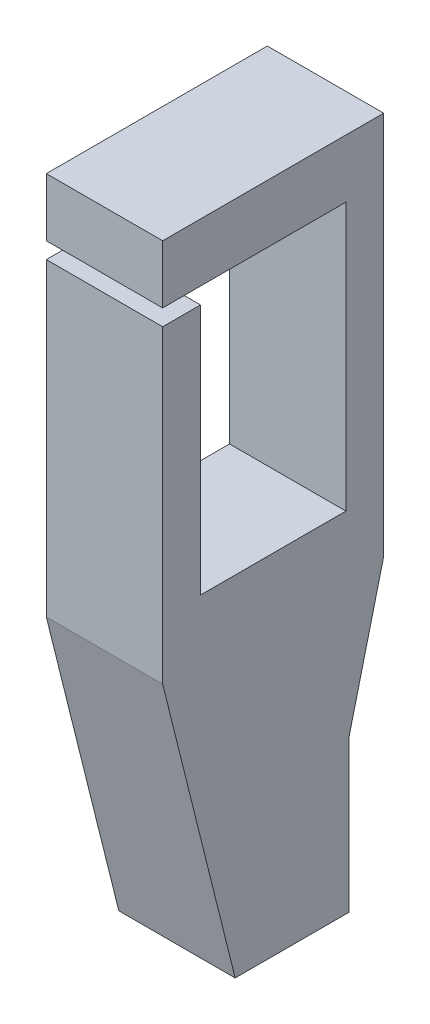
ISO-10303-21;
HEADER;
FILE_DESCRIPTION(('STEP AP214'),'2;1');
FILE_NAME('part.step','',(''),(''),'','','');
FILE_SCHEMA(('AUTOMOTIVE_DESIGN { 1 0 10303 214 1 1 1 1 }'));
ENDSEC;
DATA;
#1=APPLICATION_CONTEXT('core data for automotive mechanical design processes');
#2=APPLICATION_PROTOCOL_DEFINITION('international standard','automotive_design',2000,#1);
#3=PRODUCT_CONTEXT('',#1,'mechanical');
#4=PRODUCT('Part','Part','',(#3));
#5=PRODUCT_RELATED_PRODUCT_CATEGORY('part','',(#4));
#6=PRODUCT_DEFINITION_FORMATION('','',#4);
#7=PRODUCT_DEFINITION_CONTEXT('part definition',#1,'design');
#8=PRODUCT_DEFINITION('design','',#6,#7);
#9=PRODUCT_DEFINITION_SHAPE('','',#8);
#10=(LENGTH_UNIT() NAMED_UNIT(*) SI_UNIT(.MILLI.,.METRE.));
#11=(NAMED_UNIT(*) PLANE_ANGLE_UNIT() SI_UNIT($,.RADIAN.));
#12=(NAMED_UNIT(*) SI_UNIT($,.STERADIAN.) SOLID_ANGLE_UNIT());
#13=UNCERTAINTY_MEASURE_WITH_UNIT(LENGTH_MEASURE(1.E-05),#10,'distance_accuracy_value','');
#14=(GEOMETRIC_REPRESENTATION_CONTEXT(3) GLOBAL_UNCERTAINTY_ASSIGNED_CONTEXT((#13)) GLOBAL_UNIT_ASSIGNED_CONTEXT((#10,
#11,#12)) REPRESENTATION_CONTEXT('',''));
#15=CARTESIAN_POINT('',(0.,0.,0.));
#16=DIRECTION('',(0.,0.,1.));
#17=DIRECTION('',(1.,0.,0.));
#18=AXIS2_PLACEMENT_3D('',#15,#16,#17);
#19=CARTESIAN_POINT('',(5.,16.5,9.5));
#20=DIRECTION('',(0.,0.,-1.));
#21=DIRECTION('',(0.,1.,0.));
#22=AXIS2_PLACEMENT_3D('',#19,#20,#21);
#23=PLANE('',#22);
#24=DIRECTION('',(0.,-1.,0.));
#25=VECTOR('',#24,1.);
#26=CARTESIAN_POINT('',(5.,16.5,9.5));
#27=LINE('',#26,#25);
#28=CARTESIAN_POINT('',(5.,10.1,9.5));
#29=VERTEX_POINT('',#28);
#30=CARTESIAN_POINT('',(5.,-16.5,9.5));
#31=VERTEX_POINT('',#30);
#32=EDGE_CURVE('E222',#29,#31,#27,.T.);
#33=ORIENTED_EDGE('',*,*,#32,.F.);
#34=DIRECTION('',(1.,0.,0.));
#35=VECTOR('',#34,1.);
#36=CARTESIAN_POINT('',(-5.,10.1,9.5));
#37=LINE('',#36,#35);
#38=CARTESIAN_POINT('',(-5.,10.1,9.5));
#39=VERTEX_POINT('',#38);
#40=EDGE_CURVE('E168',#39,#29,#37,.T.);
#41=ORIENTED_EDGE('',*,*,#40,.F.);
#42=DIRECTION('',(0.,-1.,0.));
#43=VECTOR('',#42,1.);
#44=CARTESIAN_POINT('',(-5.,16.5,9.5));
#45=LINE('',#44,#43);
#46=CARTESIAN_POINT('',(-5.,-16.5,9.5));
#47=VERTEX_POINT('',#46);
#48=EDGE_CURVE('E176',#39,#47,#45,.T.);
#49=ORIENTED_EDGE('',*,*,#48,.T.);
#50=DIRECTION('',(-1.,0.,0.));
#51=VECTOR('',#50,1.);
#52=CARTESIAN_POINT('',(5.,-16.5,9.5));
#53=LINE('',#52,#51);
#54=EDGE_CURVE('E198',#31,#47,#53,.T.);
#55=ORIENTED_EDGE('',*,*,#54,.F.);
#56=EDGE_LOOP('',(#33,#41,#49,#55));
#57=FACE_BOUND('',#56,.T.);
#58=ADVANCED_FACE('F43',(#57),#23,.F.);
#59=CARTESIAN_POINT('',(5.,0.,0.));
#60=DIRECTION('',(-1.,0.,0.));
#61=DIRECTION('',(0.,0.,1.));
#62=AXIS2_PLACEMENT_3D('',#59,#60,#61);
#63=PLANE('',#62);
#64=DIRECTION('',(0.,-1.,0.));
#65=VECTOR('',#64,1.);
#66=CARTESIAN_POINT('',(5.,11.5,6.25));
#67=LINE('',#66,#65);
#68=CARTESIAN_POINT('',(5.,10.1,6.25));
#69=VERTEX_POINT('',#68);
#70=CARTESIAN_POINT('',(5.,-11.5,6.25));
#71=VERTEX_POINT('',#70);
#72=EDGE_CURVE('E65',#69,#71,#67,.T.);
#73=ORIENTED_EDGE('',*,*,#72,.F.);
#74=DIRECTION('',(0.,0.,-1.));
#75=VECTOR('',#74,1.);
#76=CARTESIAN_POINT('',(5.,10.1,6.25));
#77=LINE('',#76,#75);
#78=EDGE_CURVE('E58',#29,#69,#77,.T.);
#79=ORIENTED_EDGE('',*,*,#78,.F.);
#80=ORIENTED_EDGE('',*,*,#32,.T.);
#81=DIRECTION('',(0.,-0.970295726275996,-0.241921895599669));
#82=VECTOR('',#81,1.);
#83=CARTESIAN_POINT('',(5.,-16.5,9.5));
#84=LINE('',#83,#82);
#85=CARTESIAN_POINT('',(5.,-41.5,3.26679992892044));
#86=VERTEX_POINT('',#85);
#87=EDGE_CURVE('E218',#31,#86,#84,.T.);
#88=ORIENTED_EDGE('',*,*,#87,.T.);
#89=DIRECTION('',(0.,0.,-1.));
#90=VECTOR('',#89,1.);
#91=CARTESIAN_POINT('',(5.,-41.5,3.26679992892044));
#92=LINE('',#91,#90);
#93=CARTESIAN_POINT('',(5.,-41.5,-6.50806396588192));
#94=VERTEX_POINT('',#93);
#95=EDGE_CURVE('E216',#86,#94,#92,.T.);
#96=ORIENTED_EDGE('',*,*,#95,.T.);
#97=DIRECTION('',(0.,1.,0.));
#98=VECTOR('',#97,1.);
#99=CARTESIAN_POINT('',(5.,-41.5,-6.50806396588192));
#100=LINE('',#99,#98);
#101=CARTESIAN_POINT('',(5.,-28.5,-6.50806396588192));
#102=VERTEX_POINT('',#101);
#103=EDGE_CURVE('E192',#94,#102,#100,.T.);
#104=ORIENTED_EDGE('',*,*,#103,.T.);
#105=DIRECTION('',(0.,0.970295726275998,-0.241921895599661));
#106=VECTOR('',#105,1.);
#107=CARTESIAN_POINT('',(5.,-28.5,-6.50806396588192));
#108=LINE('',#107,#106);
#109=CARTESIAN_POINT('',(5.,-16.5,-9.5));
#110=VERTEX_POINT('',#109);
#111=EDGE_CURVE('E187',#102,#110,#108,.T.);
#112=ORIENTED_EDGE('',*,*,#111,.T.);
#113=DIRECTION('',(0.,1.,0.));
#114=VECTOR('',#113,1.);
#115=CARTESIAN_POINT('',(5.,16.5,-9.5));
#116=LINE('',#115,#114);
#117=CARTESIAN_POINT('',(5.,16.5,-9.5));
#118=VERTEX_POINT('',#117);
#119=EDGE_CURVE('E224',#110,#118,#116,.T.);
#120=ORIENTED_EDGE('',*,*,#119,.T.);
#121=DIRECTION('',(0.,0.,1.));
#122=VECTOR('',#121,1.);
#123=CARTESIAN_POINT('',(5.,16.5,9.5));
#124=LINE('',#123,#122);
#125=CARTESIAN_POINT('',(5.,16.5,9.5));
#126=VERTEX_POINT('',#125);
#127=EDGE_CURVE('E206',#118,#126,#124,.T.);
#128=ORIENTED_EDGE('',*,*,#127,.T.);
#129=CARTESIAN_POINT('',(5.,11.5,9.5));
#130=VERTEX_POINT('',#129);
#131=EDGE_CURVE('E220',#126,#130,#27,.T.);
#132=ORIENTED_EDGE('',*,*,#131,.T.);
#133=DIRECTION('',(0.,0.,1.));
#134=VECTOR('',#133,1.);
#135=CARTESIAN_POINT('',(5.,11.5,6.25));
#136=LINE('',#135,#134);
#137=CARTESIAN_POINT('',(5.,11.5,-6.25));
#138=VERTEX_POINT('',#137);
#139=EDGE_CURVE('E164',#138,#130,#136,.T.);
#140=ORIENTED_EDGE('',*,*,#139,.F.);
#141=DIRECTION('',(0.,1.,0.));
#142=VECTOR('',#141,1.);
#143=CARTESIAN_POINT('',(5.,11.5,-6.25));
#144=LINE('',#143,#142);
#145=CARTESIAN_POINT('',(5.,-11.5,-6.25));
#146=VERTEX_POINT('',#145);
#147=EDGE_CURVE('E237',#146,#138,#144,.T.);
#148=ORIENTED_EDGE('',*,*,#147,.F.);
#149=DIRECTION('',(0.,0.,-1.));
#150=VECTOR('',#149,1.);
#151=CARTESIAN_POINT('',(5.,-11.5,6.25));
#152=LINE('',#151,#150);
#153=EDGE_CURVE('E234',#71,#146,#152,.T.);
#154=ORIENTED_EDGE('',*,*,#153,.F.);
#155=EDGE_LOOP('',(#73,#79,#80,#88,#96,#104,#112,#120,#128,#132,#140,#148,#154));
#156=FACE_BOUND('',#155,.T.);
#157=ADVANCED_FACE('F280',(#156),#63,.F.);
#158=CARTESIAN_POINT('',(-5.,0.,0.));
#159=DIRECTION('',(-1.,0.,0.));
#160=DIRECTION('',(0.,0.,1.));
#161=AXIS2_PLACEMENT_3D('',#158,#159,#160);
#162=PLANE('',#161);
#163=DIRECTION('',(0.,0.,-1.));
#164=VECTOR('',#163,1.);
#165=CARTESIAN_POINT('',(-5.,10.1,6.25));
#166=LINE('',#165,#164);
#167=CARTESIAN_POINT('',(-5.,10.1,6.25));
#168=VERTEX_POINT('',#167);
#169=EDGE_CURVE('E169',#39,#168,#166,.T.);
#170=ORIENTED_EDGE('',*,*,#169,.T.);
#171=DIRECTION('',(0.,-1.,0.));
#172=VECTOR('',#171,1.);
#173=CARTESIAN_POINT('',(-5.,11.5,6.25));
#174=LINE('',#173,#172);
#175=CARTESIAN_POINT('',(-5.,-11.5,6.25));
#176=VERTEX_POINT('',#175);
#177=EDGE_CURVE('E158',#168,#176,#174,.T.);
#178=ORIENTED_EDGE('',*,*,#177,.T.);
#179=DIRECTION('',(0.,0.,-1.));
#180=VECTOR('',#179,1.);
#181=CARTESIAN_POINT('',(-5.,-11.5,6.25));
#182=LINE('',#181,#180);
#183=CARTESIAN_POINT('',(-5.,-11.5,-6.25));
#184=VERTEX_POINT('',#183);
#185=EDGE_CURVE('E235',#176,#184,#182,.T.);
#186=ORIENTED_EDGE('',*,*,#185,.T.);
#187=DIRECTION('',(0.,1.,0.));
#188=VECTOR('',#187,1.);
#189=CARTESIAN_POINT('',(-5.,11.5,-6.25));
#190=LINE('',#189,#188);
#191=CARTESIAN_POINT('',(-5.,11.5,-6.25));
#192=VERTEX_POINT('',#191);
#193=EDGE_CURVE('E154',#184,#192,#190,.T.);
#194=ORIENTED_EDGE('',*,*,#193,.T.);
#195=DIRECTION('',(0.,0.,1.));
#196=VECTOR('',#195,1.);
#197=CARTESIAN_POINT('',(-5.,11.5,6.25));
#198=LINE('',#197,#196);
#199=CARTESIAN_POINT('',(-5.,11.5,9.5));
#200=VERTEX_POINT('',#199);
#201=EDGE_CURVE('E145',#192,#200,#198,.T.);
#202=ORIENTED_EDGE('',*,*,#201,.T.);
#203=CARTESIAN_POINT('',(-5.,16.5,9.5));
#204=VERTEX_POINT('',#203);
#205=EDGE_CURVE('E152',#204,#200,#45,.T.);
#206=ORIENTED_EDGE('',*,*,#205,.F.);
#207=DIRECTION('',(0.,0.,1.));
#208=VECTOR('',#207,1.);
#209=CARTESIAN_POINT('',(-5.,16.5,9.5));
#210=LINE('',#209,#208);
#211=CARTESIAN_POINT('',(-5.,16.5,-9.5));
#212=VERTEX_POINT('',#211);
#213=EDGE_CURVE('E180',#212,#204,#210,.T.);
#214=ORIENTED_EDGE('',*,*,#213,.F.);
#215=DIRECTION('',(0.,1.,0.));
#216=VECTOR('',#215,1.);
#217=CARTESIAN_POINT('',(-5.,16.5,-9.5));
#218=LINE('',#217,#216);
#219=CARTESIAN_POINT('',(-5.,-16.5,-9.5));
#220=VERTEX_POINT('',#219);
#221=EDGE_CURVE('E209',#220,#212,#218,.T.);
#222=ORIENTED_EDGE('',*,*,#221,.F.);
#223=DIRECTION('',(0.,0.970295726275998,-0.241921895599661));
#224=VECTOR('',#223,1.);
#225=CARTESIAN_POINT('',(-5.,-28.5,-6.50806396588192));
#226=LINE('',#225,#224);
#227=CARTESIAN_POINT('',(-5.,-28.5,-6.50806396588192));
#228=VERTEX_POINT('',#227);
#229=EDGE_CURVE('E210',#228,#220,#226,.T.);
#230=ORIENTED_EDGE('',*,*,#229,.F.);
#231=DIRECTION('',(0.,1.,0.));
#232=VECTOR('',#231,1.);
#233=CARTESIAN_POINT('',(-5.,-41.5,-6.50806396588192));
#234=LINE('',#233,#232);
#235=CARTESIAN_POINT('',(-5.,-41.5,-6.50806396588192));
#236=VERTEX_POINT('',#235);
#237=EDGE_CURVE('E185',#236,#228,#234,.T.);
#238=ORIENTED_EDGE('',*,*,#237,.F.);
#239=DIRECTION('',(0.,0.,-1.));
#240=VECTOR('',#239,1.);
#241=CARTESIAN_POINT('',(-5.,-41.5,3.26679992892044));
#242=LINE('',#241,#240);
#243=CARTESIAN_POINT('',(-5.,-41.5,3.26679992892044));
#244=VERTEX_POINT('',#243);
#245=EDGE_CURVE('E178',#244,#236,#242,.T.);
#246=ORIENTED_EDGE('',*,*,#245,.F.);
#247=DIRECTION('',(0.,-0.970295726275996,-0.241921895599669));
#248=VECTOR('',#247,1.);
#249=CARTESIAN_POINT('',(-5.,-16.5,9.5));
#250=LINE('',#249,#248);
#251=EDGE_CURVE('E175',#47,#244,#250,.T.);
#252=ORIENTED_EDGE('',*,*,#251,.F.);
#253=ORIENTED_EDGE('',*,*,#48,.F.);
#254=EDGE_LOOP('',(#170,#178,#186,#194,#202,#206,#214,#222,#230,#238,#246,#252,#253));
#255=FACE_BOUND('',#254,.T.);
#256=CARTESIAN_POINT('',(-5.,-13.9,0.));
#257=DIRECTION('',(-1.,0.,0.));
#258=DIRECTION('',(0.,0.,1.));
#259=AXIS2_PLACEMENT_3D('',#256,#257,#258);
#260=CIRCLE('',#259,1.5);
#261=CARTESIAN_POINT('',(-5.,-13.9,1.5));
#262=VERTEX_POINT('',#261);
#263=EDGE_CURVE('E259',#262,#262,#260,.T.);
#264=ORIENTED_EDGE('',*,*,#263,.F.);
#265=EDGE_LOOP('',(#264));
#266=FACE_BOUND('',#265,.T.);
#267=CARTESIAN_POINT('',(-5.,13.9,0.));
#268=DIRECTION('',(-1.,0.,0.));
#269=DIRECTION('',(0.,0.,1.));
#270=AXIS2_PLACEMENT_3D('',#267,#268,#269);
#271=CIRCLE('',#270,1.5);
#272=CARTESIAN_POINT('',(-5.,13.9,1.5));
#273=VERTEX_POINT('',#272);
#274=EDGE_CURVE('E250',#273,#273,#271,.T.);
#275=ORIENTED_EDGE('',*,*,#274,.F.);
#276=EDGE_LOOP('',(#275));
#277=FACE_BOUND('',#276,.T.);
#278=ADVANCED_FACE('F148',(#255,#266,#277),#162,.T.);
#279=CARTESIAN_POINT('',(5.,-28.5,-6.50806396588192));
#280=DIRECTION('',(0.,0.241921895599661,0.970295726275998));
#281=DIRECTION('',(0.,-0.970295726275998,0.241921895599661));
#282=AXIS2_PLACEMENT_3D('',#279,#280,#281);
#283=PLANE('',#282);
#284=ORIENTED_EDGE('',*,*,#229,.T.);
#285=DIRECTION('',(-1.,0.,0.));
#286=VECTOR('',#285,1.);
#287=CARTESIAN_POINT('',(5.,-16.5,-9.5));
#288=LINE('',#287,#286);
#289=EDGE_CURVE('E11',#110,#220,#288,.T.);
#290=ORIENTED_EDGE('',*,*,#289,.F.);
#291=ORIENTED_EDGE('',*,*,#111,.F.);
#292=DIRECTION('',(-1.,0.,0.));
#293=VECTOR('',#292,1.);
#294=CARTESIAN_POINT('',(5.,-28.5,-6.50806396588192));
#295=LINE('',#294,#293);
#296=EDGE_CURVE('E188',#102,#228,#295,.T.);
#297=ORIENTED_EDGE('',*,*,#296,.T.);
#298=EDGE_LOOP('',(#284,#290,#291,#297));
#299=FACE_BOUND('',#298,.T.);
#300=ADVANCED_FACE('F45',(#299),#283,.F.);
#301=CARTESIAN_POINT('',(5.,16.5,-9.5));
#302=DIRECTION('',(0.,0.,1.));
#303=DIRECTION('',(0.,-1.,0.));
#304=AXIS2_PLACEMENT_3D('',#301,#302,#303);
#305=PLANE('',#304);
#306=ORIENTED_EDGE('',*,*,#221,.T.);
#307=DIRECTION('',(-1.,0.,0.));
#308=VECTOR('',#307,1.);
#309=CARTESIAN_POINT('',(5.,16.5,-9.5));
#310=LINE('',#309,#308);
#311=EDGE_CURVE('E51',#118,#212,#310,.T.);
#312=ORIENTED_EDGE('',*,*,#311,.F.);
#313=ORIENTED_EDGE('',*,*,#119,.F.);
#314=ORIENTED_EDGE('',*,*,#289,.T.);
#315=EDGE_LOOP('',(#306,#312,#313,#314));
#316=FACE_BOUND('',#315,.T.);
#317=ADVANCED_FACE('F283',(#316),#305,.F.);
#318=CARTESIAN_POINT('',(5.,16.5,9.5));
#319=DIRECTION('',(0.,-1.,0.));
#320=DIRECTION('',(0.,0.,-1.));
#321=AXIS2_PLACEMENT_3D('',#318,#319,#320);
#322=PLANE('',#321);
#323=ORIENTED_EDGE('',*,*,#213,.T.);
#324=DIRECTION('',(-1.,0.,0.));
#325=VECTOR('',#324,1.);
#326=CARTESIAN_POINT('',(5.,16.5,9.5));
#327=LINE('',#326,#325);
#328=EDGE_CURVE('E174',#126,#204,#327,.T.);
#329=ORIENTED_EDGE('',*,*,#328,.F.);
#330=ORIENTED_EDGE('',*,*,#127,.F.);
#331=ORIENTED_EDGE('',*,*,#311,.T.);
#332=EDGE_LOOP('',(#323,#329,#330,#331));
#333=FACE_BOUND('',#332,.T.);
#334=ADVANCED_FACE('F205',(#333),#322,.F.);
#335=ORIENTED_EDGE('',*,*,#205,.T.);
#336=DIRECTION('',(1.,0.,0.));
#337=VECTOR('',#336,1.);
#338=CARTESIAN_POINT('',(-5.,11.5,9.5));
#339=LINE('',#338,#337);
#340=EDGE_CURVE('E161',#200,#130,#339,.T.);
#341=ORIENTED_EDGE('',*,*,#340,.T.);
#342=ORIENTED_EDGE('',*,*,#131,.F.);
#343=ORIENTED_EDGE('',*,*,#328,.T.);
#344=EDGE_LOOP('',(#335,#341,#342,#343));
#345=FACE_BOUND('',#344,.T.);
#346=ADVANCED_FACE('F172',(#345),#23,.F.);
#347=CARTESIAN_POINT('',(5.,-16.5,9.5));
#348=DIRECTION('',(0.,0.241921895599669,-0.970295726275996));
#349=DIRECTION('',(0.,0.970295726275996,0.241921895599669));
#350=AXIS2_PLACEMENT_3D('',#347,#348,#349);
#351=PLANE('',#350);
#352=ORIENTED_EDGE('',*,*,#251,.T.);
#353=DIRECTION('',(-1.,0.,0.));
#354=VECTOR('',#353,1.);
#355=CARTESIAN_POINT('',(5.,-41.5,3.26679992892044));
#356=LINE('',#355,#354);
#357=EDGE_CURVE('E195',#86,#244,#356,.T.);
#358=ORIENTED_EDGE('',*,*,#357,.F.);
#359=ORIENTED_EDGE('',*,*,#87,.F.);
#360=ORIENTED_EDGE('',*,*,#54,.T.);
#361=EDGE_LOOP('',(#352,#358,#359,#360));
#362=FACE_BOUND('',#361,.T.);
#363=ADVANCED_FACE('F298',(#362),#351,.F.);
#364=CARTESIAN_POINT('',(5.,-41.5,3.26679992892044));
#365=DIRECTION('',(0.,1.,0.));
#366=DIRECTION('',(0.,0.,1.));
#367=AXIS2_PLACEMENT_3D('',#364,#365,#366);
#368=PLANE('',#367);
#369=ORIENTED_EDGE('',*,*,#245,.T.);
#370=DIRECTION('',(-1.,0.,0.));
#371=VECTOR('',#370,1.);
#372=CARTESIAN_POINT('',(5.,-41.5,-6.50806396588192));
#373=LINE('',#372,#371);
#374=EDGE_CURVE('E191',#94,#236,#373,.T.);
#375=ORIENTED_EDGE('',*,*,#374,.F.);
#376=ORIENTED_EDGE('',*,*,#95,.F.);
#377=ORIENTED_EDGE('',*,*,#357,.T.);
#378=EDGE_LOOP('',(#369,#375,#376,#377));
#379=FACE_BOUND('',#378,.T.);
#380=ADVANCED_FACE('F294',(#379),#368,.F.);
#381=CARTESIAN_POINT('',(5.,-41.5,-6.50806396588192));
#382=DIRECTION('',(0.,0.,1.));
#383=DIRECTION('',(0.,-1.,0.));
#384=AXIS2_PLACEMENT_3D('',#381,#382,#383);
#385=PLANE('',#384);
#386=ORIENTED_EDGE('',*,*,#237,.T.);
#387=ORIENTED_EDGE('',*,*,#296,.F.);
#388=ORIENTED_EDGE('',*,*,#103,.F.);
#389=ORIENTED_EDGE('',*,*,#374,.T.);
#390=EDGE_LOOP('',(#386,#387,#388,#389));
#391=FACE_BOUND('',#390,.T.);
#392=ADVANCED_FACE('F289',(#391),#385,.F.);
#393=CARTESIAN_POINT('',(5.,11.5,-6.25));
#394=DIRECTION('',(0.,0.,1.));
#395=DIRECTION('',(0.,-1.,0.));
#396=AXIS2_PLACEMENT_3D('',#393,#394,#395);
#397=PLANE('',#396);
#398=ORIENTED_EDGE('',*,*,#193,.F.);
#399=DIRECTION('',(-1.,0.,0.));
#400=VECTOR('',#399,1.);
#401=CARTESIAN_POINT('',(5.,-11.5,-6.25));
#402=LINE('',#401,#400);
#403=EDGE_CURVE('E231',#146,#184,#402,.T.);
#404=ORIENTED_EDGE('',*,*,#403,.F.);
#405=ORIENTED_EDGE('',*,*,#147,.T.);
#406=DIRECTION('',(-1.,0.,0.));
#407=VECTOR('',#406,1.);
#408=CARTESIAN_POINT('',(5.,11.5,-6.25));
#409=LINE('',#408,#407);
#410=EDGE_CURVE('E212',#138,#192,#409,.T.);
#411=ORIENTED_EDGE('',*,*,#410,.T.);
#412=EDGE_LOOP('',(#398,#404,#405,#411));
#413=FACE_BOUND('',#412,.T.);
#414=ADVANCED_FACE('F278',(#413),#397,.T.);
#415=CARTESIAN_POINT('',(5.,11.5,6.25));
#416=DIRECTION('',(0.,-1.,0.));
#417=DIRECTION('',(0.,0.,-1.));
#418=AXIS2_PLACEMENT_3D('',#415,#416,#417);
#419=PLANE('',#418);
#420=ORIENTED_EDGE('',*,*,#201,.F.);
#421=ORIENTED_EDGE('',*,*,#410,.F.);
#422=ORIENTED_EDGE('',*,*,#139,.T.);
#423=ORIENTED_EDGE('',*,*,#340,.F.);
#424=EDGE_LOOP('',(#420,#421,#422,#423));
#425=FACE_BOUND('',#424,.T.);
#426=ADVANCED_FACE('F162',(#425),#419,.T.);
#427=CARTESIAN_POINT('',(5.,11.5,6.25));
#428=DIRECTION('',(0.,0.,-1.));
#429=DIRECTION('',(0.,1.,0.));
#430=AXIS2_PLACEMENT_3D('',#427,#428,#429);
#431=PLANE('',#430);
#432=DIRECTION('',(1.,0.,0.));
#433=VECTOR('',#432,1.);
#434=CARTESIAN_POINT('',(-5.,10.1,6.25));
#435=LINE('',#434,#433);
#436=EDGE_CURVE('E261',#168,#69,#435,.T.);
#437=ORIENTED_EDGE('',*,*,#436,.T.);
#438=ORIENTED_EDGE('',*,*,#72,.T.);
#439=DIRECTION('',(-1.,0.,0.));
#440=VECTOR('',#439,1.);
#441=CARTESIAN_POINT('',(5.,-11.5,6.25));
#442=LINE('',#441,#440);
#443=EDGE_CURVE('E229',#71,#176,#442,.T.);
#444=ORIENTED_EDGE('',*,*,#443,.T.);
#445=ORIENTED_EDGE('',*,*,#177,.F.);
#446=EDGE_LOOP('',(#437,#438,#444,#445));
#447=FACE_BOUND('',#446,.T.);
#448=ADVANCED_FACE('F270',(#447),#431,.T.);
#449=CARTESIAN_POINT('',(5.,-11.5,6.25));
#450=DIRECTION('',(0.,1.,0.));
#451=DIRECTION('',(0.,0.,1.));
#452=AXIS2_PLACEMENT_3D('',#449,#450,#451);
#453=PLANE('',#452);
#454=ORIENTED_EDGE('',*,*,#185,.F.);
#455=ORIENTED_EDGE('',*,*,#443,.F.);
#456=ORIENTED_EDGE('',*,*,#153,.T.);
#457=ORIENTED_EDGE('',*,*,#403,.T.);
#458=EDGE_LOOP('',(#454,#455,#456,#457));
#459=FACE_BOUND('',#458,.T.);
#460=ADVANCED_FACE('F274',(#459),#453,.T.);
#461=CARTESIAN_POINT('',(2.99999999999999,13.9,0.));
#462=DIRECTION('',(-1.,0.,0.));
#463=DIRECTION('',(0.,0.,1.));
#464=AXIS2_PLACEMENT_3D('',#461,#462,#463);
#465=CONICAL_SURFACE('',#464,0.869999999999987,1.02974425867664);
#466=CARTESIAN_POINT('',(3.52274873855398,13.9,0.));
#467=VERTEX_POINT('',#466);
#468=VERTEX_LOOP('',#467);
#469=FACE_BOUND('',#468,.T.);
#470=CARTESIAN_POINT('',(2.99999999999999,13.9,0.));
#471=DIRECTION('',(-1.,0.,0.));
#472=DIRECTION('',(0.,0.,1.));
#473=AXIS2_PLACEMENT_3D('',#470,#471,#472);
#474=CIRCLE('',#473,0.869999999999987);
#475=CARTESIAN_POINT('',(2.99999999999999,13.9,0.869999999999987));
#476=VERTEX_POINT('',#475);
#477=EDGE_CURVE('E240',#476,#476,#474,.T.);
#478=ORIENTED_EDGE('',*,*,#477,.T.);
#479=EDGE_LOOP('',(#478));
#480=FACE_BOUND('',#479,.T.);
#481=ADVANCED_FACE('F367',(#469,#480),#465,.F.);
#482=CARTESIAN_POINT('',(-5.,13.9,0.));
#483=DIRECTION('',(-1.,0.,0.));
#484=DIRECTION('',(0.,0.,1.));
#485=AXIS2_PLACEMENT_3D('',#482,#483,#484);
#486=CYLINDRICAL_SURFACE('',#485,0.869999999999993);
#487=ORIENTED_EDGE('',*,*,#477,.F.);
#488=EDGE_LOOP('',(#487));
#489=FACE_BOUND('',#488,.T.);
#490=CARTESIAN_POINT('',(-4.37,13.9,0.));
#491=DIRECTION('',(-1.,0.,0.));
#492=DIRECTION('',(0.,0.,1.));
#493=AXIS2_PLACEMENT_3D('',#490,#491,#492);
#494=CIRCLE('',#493,0.869999999999999);
#495=CARTESIAN_POINT('',(-4.37,13.9,0.869999999999999));
#496=VERTEX_POINT('',#495);
#497=EDGE_CURVE('E247',#496,#496,#494,.T.);
#498=ORIENTED_EDGE('',*,*,#497,.T.);
#499=EDGE_LOOP('',(#498));
#500=FACE_BOUND('',#499,.T.);
#501=ADVANCED_FACE('F376',(#489,#500),#486,.F.);
#502=CARTESIAN_POINT('',(-5.,13.9,0.));
#503=DIRECTION('',(-1.,0.,0.));
#504=DIRECTION('',(0.,0.,1.));
#505=AXIS2_PLACEMENT_3D('',#502,#503,#504);
#506=CONICAL_SURFACE('',#505,1.5,0.785398163397448);
#507=ORIENTED_EDGE('',*,*,#497,.F.);
#508=EDGE_LOOP('',(#507));
#509=FACE_BOUND('',#508,.T.);
#510=ORIENTED_EDGE('',*,*,#274,.T.);
#511=EDGE_LOOP('',(#510));
#512=FACE_BOUND('',#511,.T.);
#513=ADVANCED_FACE('F385',(#509,#512),#506,.F.);
#514=CARTESIAN_POINT('',(2.99999999999999,-13.9,0.));
#515=DIRECTION('',(-1.,0.,0.));
#516=DIRECTION('',(0.,0.,1.));
#517=AXIS2_PLACEMENT_3D('',#514,#515,#516);
#518=CONICAL_SURFACE('',#517,0.869999999999987,1.02974425867664);
#519=CARTESIAN_POINT('',(3.52274873855398,-13.9,0.));
#520=VERTEX_POINT('',#519);
#521=VERTEX_LOOP('',#520);
#522=FACE_BOUND('',#521,.T.);
#523=CARTESIAN_POINT('',(2.99999999999999,-13.9,0.));
#524=DIRECTION('',(-1.,0.,0.));
#525=DIRECTION('',(0.,0.,1.));
#526=AXIS2_PLACEMENT_3D('',#523,#524,#525);
#527=CIRCLE('',#526,0.869999999999987);
#528=CARTESIAN_POINT('',(2.99999999999999,-13.9,0.869999999999987));
#529=VERTEX_POINT('',#528);
#530=EDGE_CURVE('E253',#529,#529,#527,.T.);
#531=ORIENTED_EDGE('',*,*,#530,.T.);
#532=EDGE_LOOP('',(#531));
#533=FACE_BOUND('',#532,.T.);
#534=ADVANCED_FACE('F394',(#522,#533),#518,.F.);
#535=CARTESIAN_POINT('',(-5.,-13.9,0.));
#536=DIRECTION('',(-1.,0.,0.));
#537=DIRECTION('',(0.,0.,1.));
#538=AXIS2_PLACEMENT_3D('',#535,#536,#537);
#539=CYLINDRICAL_SURFACE('',#538,0.869999999999993);
#540=ORIENTED_EDGE('',*,*,#530,.F.);
#541=EDGE_LOOP('',(#540));
#542=FACE_BOUND('',#541,.T.);
#543=CARTESIAN_POINT('',(-4.37,-13.9,0.));
#544=DIRECTION('',(-1.,0.,0.));
#545=DIRECTION('',(0.,0.,1.));
#546=AXIS2_PLACEMENT_3D('',#543,#544,#545);
#547=CIRCLE('',#546,0.869999999999999);
#548=CARTESIAN_POINT('',(-4.37,-13.9,0.869999999999999));
#549=VERTEX_POINT('',#548);
#550=EDGE_CURVE('E256',#549,#549,#547,.T.);
#551=ORIENTED_EDGE('',*,*,#550,.T.);
#552=EDGE_LOOP('',(#551));
#553=FACE_BOUND('',#552,.T.);
#554=ADVANCED_FACE('F310',(#542,#553),#539,.F.);
#555=CARTESIAN_POINT('',(-5.,-13.9,0.));
#556=DIRECTION('',(-1.,0.,0.));
#557=DIRECTION('',(0.,0.,1.));
#558=AXIS2_PLACEMENT_3D('',#555,#556,#557);
#559=CONICAL_SURFACE('',#558,1.5,0.785398163397448);
#560=ORIENTED_EDGE('',*,*,#550,.F.);
#561=EDGE_LOOP('',(#560));
#562=FACE_BOUND('',#561,.T.);
#563=ORIENTED_EDGE('',*,*,#263,.T.);
#564=EDGE_LOOP('',(#563));
#565=FACE_BOUND('',#564,.T.);
#566=ADVANCED_FACE('F304',(#562,#565),#559,.F.);
#567=CARTESIAN_POINT('',(-5.,10.1,6.25));
#568=DIRECTION('',(0.,-1.,0.));
#569=DIRECTION('',(0.,0.,-1.));
#570=AXIS2_PLACEMENT_3D('',#567,#568,#569);
#571=PLANE('',#570);
#572=ORIENTED_EDGE('',*,*,#78,.T.);
#573=ORIENTED_EDGE('',*,*,#436,.F.);
#574=ORIENTED_EDGE('',*,*,#169,.F.);
#575=ORIENTED_EDGE('',*,*,#40,.T.);
#576=EDGE_LOOP('',(#572,#573,#574,#575));
#577=FACE_BOUND('',#576,.T.);
#578=ADVANCED_FACE('F302',(#577),#571,.F.);
#579=CLOSED_SHELL('',(#58,#157,#278,#300,#317,#334,#346,#363,#380,#392,#414,#426,#448,#460,#481,
#501,#513,#534,#554,#566,#578));
#580=MANIFOLD_SOLID_BREP('B2',#579);
#581=ADVANCED_BREP_SHAPE_REPRESENTATION('',(#18,#580),#14);
#582=SHAPE_DEFINITION_REPRESENTATION(#9,#581);
ENDSEC;
END-ISO-10303-21;
